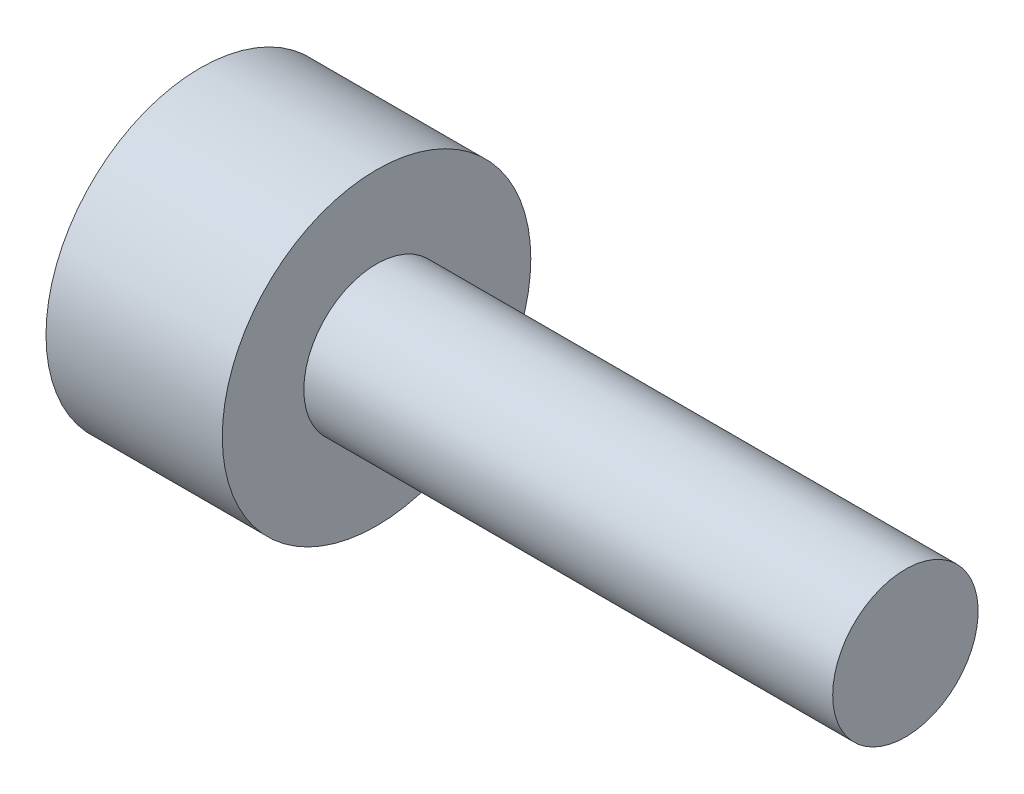
ISO-10303-21;
HEADER;
FILE_DESCRIPTION(('STEP AP214'),'2;1');
FILE_NAME('part.step','',(''),(''),'','','');
FILE_SCHEMA(('AUTOMOTIVE_DESIGN { 1 0 10303 214 1 1 1 1 }'));
ENDSEC;
DATA;
#1=APPLICATION_CONTEXT('core data for automotive mechanical design processes');
#2=APPLICATION_PROTOCOL_DEFINITION('international standard','automotive_design',2000,#1);
#3=PRODUCT_CONTEXT('',#1,'mechanical');
#4=PRODUCT('Part','Part','',(#3));
#5=PRODUCT_RELATED_PRODUCT_CATEGORY('part','',(#4));
#6=PRODUCT_DEFINITION_FORMATION('','',#4);
#7=PRODUCT_DEFINITION_CONTEXT('part definition',#1,'design');
#8=PRODUCT_DEFINITION('design','',#6,#7);
#9=PRODUCT_DEFINITION_SHAPE('','',#8);
#10=(LENGTH_UNIT() NAMED_UNIT(*) SI_UNIT(.MILLI.,.METRE.));
#11=(NAMED_UNIT(*) PLANE_ANGLE_UNIT() SI_UNIT($,.RADIAN.));
#12=(NAMED_UNIT(*) SI_UNIT($,.STERADIAN.) SOLID_ANGLE_UNIT());
#13=UNCERTAINTY_MEASURE_WITH_UNIT(LENGTH_MEASURE(1.E-05),#10,'distance_accuracy_value','');
#14=(GEOMETRIC_REPRESENTATION_CONTEXT(3) GLOBAL_UNCERTAINTY_ASSIGNED_CONTEXT((#13)) GLOBAL_UNIT_ASSIGNED_CONTEXT((#10,
#11,#12)) REPRESENTATION_CONTEXT('',''));
#15=CARTESIAN_POINT('',(0.,0.,0.));
#16=DIRECTION('',(0.,0.,1.));
#17=DIRECTION('',(1.,0.,0.));
#18=AXIS2_PLACEMENT_3D('',#15,#16,#17);
#19=CARTESIAN_POINT('',(-4.,0.,0.));
#20=DIRECTION('',(1.,0.,0.));
#21=DIRECTION('',(0.,0.,-1.));
#22=AXIS2_PLACEMENT_3D('',#19,#20,#21);
#23=PLANE('',#22);
#24=CARTESIAN_POINT('',(-4.,0.,0.));
#25=DIRECTION('',(-1.,0.,0.));
#26=DIRECTION('',(0.,0.,1.));
#27=AXIS2_PLACEMENT_3D('',#24,#25,#26);
#28=CIRCLE('',#27,3.5);
#29=CARTESIAN_POINT('',(-4.,0.,3.5));
#30=VERTEX_POINT('',#29);
#31=EDGE_CURVE('E11',#30,#30,#28,.T.);
#32=ORIENTED_EDGE('',*,*,#31,.T.);
#33=EDGE_LOOP('',(#32));
#34=FACE_BOUND('',#33,.T.);
#35=DIRECTION('',(0.,0.866025403784439,-0.5));
#36=VECTOR('',#35,1.);
#37=CARTESIAN_POINT('',(-4.,-1.5,-0.866025403784439));
#38=LINE('',#37,#36);
#39=CARTESIAN_POINT('',(-4.,-1.5,-0.866025403784439));
#40=VERTEX_POINT('',#39);
#41=CARTESIAN_POINT('',(-4.,0.,-1.73205080756888));
#42=VERTEX_POINT('',#41);
#43=EDGE_CURVE('E54',#40,#42,#38,.T.);
#44=ORIENTED_EDGE('',*,*,#43,.T.);
#45=DIRECTION('',(0.,0.866025403784439,0.5));
#46=VECTOR('',#45,1.);
#47=CARTESIAN_POINT('',(-4.,0.,-1.73205080756888));
#48=LINE('',#47,#46);
#49=CARTESIAN_POINT('',(-4.,1.5,-0.866025403784439));
#50=VERTEX_POINT('',#49);
#51=EDGE_CURVE('E127',#42,#50,#48,.T.);
#52=ORIENTED_EDGE('',*,*,#51,.T.);
#53=DIRECTION('',(0.,0.,1.));
#54=VECTOR('',#53,1.);
#55=CARTESIAN_POINT('',(-4.,1.5,-0.866025403784439));
#56=LINE('',#55,#54);
#57=CARTESIAN_POINT('',(-4.,1.5,0.866025403784438));
#58=VERTEX_POINT('',#57);
#59=EDGE_CURVE('E129',#50,#58,#56,.T.);
#60=ORIENTED_EDGE('',*,*,#59,.T.);
#61=DIRECTION('',(0.,-0.866025403784438,0.5));
#62=VECTOR('',#61,1.);
#63=CARTESIAN_POINT('',(-4.,1.5,0.866025403784438));
#64=LINE('',#63,#62);
#65=CARTESIAN_POINT('',(-4.,0.,1.73205080756888));
#66=VERTEX_POINT('',#65);
#67=EDGE_CURVE('E135',#58,#66,#64,.T.);
#68=ORIENTED_EDGE('',*,*,#67,.T.);
#69=DIRECTION('',(0.,-0.866025403784439,-0.5));
#70=VECTOR('',#69,1.);
#71=CARTESIAN_POINT('',(-4.,0.,1.73205080756888));
#72=LINE('',#71,#70);
#73=CARTESIAN_POINT('',(-4.,-1.5,0.866025403784439));
#74=VERTEX_POINT('',#73);
#75=EDGE_CURVE('E116',#66,#74,#72,.T.);
#76=ORIENTED_EDGE('',*,*,#75,.T.);
#77=DIRECTION('',(0.,0.,-1.));
#78=VECTOR('',#77,1.);
#79=CARTESIAN_POINT('',(-4.,-1.5,0.866025403784439));
#80=LINE('',#79,#78);
#81=EDGE_CURVE('E134',#74,#40,#80,.T.);
#82=ORIENTED_EDGE('',*,*,#81,.T.);
#83=EDGE_LOOP('',(#44,#52,#60,#68,#76,#82));
#84=FACE_BOUND('',#83,.T.);
#85=ADVANCED_FACE('F41',(#34,#84),#23,.F.);
#86=CARTESIAN_POINT('',(-1000.,0.,0.));
#87=DIRECTION('',(-1.,0.,0.));
#88=DIRECTION('',(0.,0.,1.));
#89=AXIS2_PLACEMENT_3D('',#86,#87,#88);
#90=CYLINDRICAL_SURFACE('',#89,3.5);
#91=ORIENTED_EDGE('',*,*,#31,.F.);
#92=EDGE_LOOP('',(#91));
#93=FACE_BOUND('',#92,.T.);
#94=CARTESIAN_POINT('',(0.,0.,0.));
#95=DIRECTION('',(-1.,0.,0.));
#96=DIRECTION('',(0.,0.,1.));
#97=AXIS2_PLACEMENT_3D('',#94,#95,#96);
#98=CIRCLE('',#97,3.5);
#99=CARTESIAN_POINT('',(0.,0.,3.5));
#100=VERTEX_POINT('',#99);
#101=EDGE_CURVE('E48',#100,#100,#98,.T.);
#102=ORIENTED_EDGE('',*,*,#101,.T.);
#103=EDGE_LOOP('',(#102));
#104=FACE_BOUND('',#103,.T.);
#105=ADVANCED_FACE('F152',(#93,#104),#90,.T.);
#106=CARTESIAN_POINT('',(0.,3.5,0.));
#107=DIRECTION('',(-1.,0.,0.));
#108=DIRECTION('',(0.,0.,1.));
#109=AXIS2_PLACEMENT_3D('',#106,#107,#108);
#110=PLANE('',#109);
#111=ORIENTED_EDGE('',*,*,#101,.F.);
#112=EDGE_LOOP('',(#111));
#113=FACE_BOUND('',#112,.T.);
#114=CARTESIAN_POINT('',(0.,0.,0.));
#115=DIRECTION('',(-1.,0.,0.));
#116=DIRECTION('',(0.,0.,1.));
#117=AXIS2_PLACEMENT_3D('',#114,#115,#116);
#118=CIRCLE('',#117,1.65);
#119=CARTESIAN_POINT('',(0.,0.,1.65));
#120=VERTEX_POINT('',#119);
#121=EDGE_CURVE('E149',#120,#120,#118,.T.);
#122=ORIENTED_EDGE('',*,*,#121,.T.);
#123=EDGE_LOOP('',(#122));
#124=FACE_BOUND('',#123,.T.);
#125=ADVANCED_FACE('F156',(#113,#124),#110,.F.);
#126=CARTESIAN_POINT('',(-1000.,0.,0.));
#127=DIRECTION('',(-1.,0.,0.));
#128=DIRECTION('',(0.,0.,1.));
#129=AXIS2_PLACEMENT_3D('',#126,#127,#128);
#130=CYLINDRICAL_SURFACE('',#129,1.65);
#131=ORIENTED_EDGE('',*,*,#121,.F.);
#132=EDGE_LOOP('',(#131));
#133=FACE_BOUND('',#132,.T.);
#134=CARTESIAN_POINT('',(12.,0.,0.));
#135=DIRECTION('',(-1.,0.,0.));
#136=DIRECTION('',(0.,0.,1.));
#137=AXIS2_PLACEMENT_3D('',#134,#135,#136);
#138=CIRCLE('',#137,1.65);
#139=CARTESIAN_POINT('',(12.,0.,1.65));
#140=VERTEX_POINT('',#139);
#141=EDGE_CURVE('E148',#140,#140,#138,.T.);
#142=ORIENTED_EDGE('',*,*,#141,.T.);
#143=EDGE_LOOP('',(#142));
#144=FACE_BOUND('',#143,.T.);
#145=ADVANCED_FACE('F157',(#133,#144),#130,.T.);
#146=CARTESIAN_POINT('',(12.,1.65,0.));
#147=DIRECTION('',(-1.,0.,0.));
#148=DIRECTION('',(0.,0.,1.));
#149=AXIS2_PLACEMENT_3D('',#146,#147,#148);
#150=PLANE('',#149);
#151=ORIENTED_EDGE('',*,*,#141,.F.);
#152=EDGE_LOOP('',(#151));
#153=FACE_BOUND('',#152,.T.);
#154=ADVANCED_FACE('F164',(#153),#150,.F.);
#155=CARTESIAN_POINT('',(-2.,-1.5,-0.866025403784439));
#156=DIRECTION('',(0.,0.5,0.866025403784439));
#157=DIRECTION('',(0.,-0.866025403784439,0.5));
#158=AXIS2_PLACEMENT_3D('',#155,#156,#157);
#159=PLANE('',#158);
#160=ORIENTED_EDGE('',*,*,#43,.F.);
#161=DIRECTION('',(-1.,0.,0.));
#162=VECTOR('',#161,1.);
#163=CARTESIAN_POINT('',(-2.,-1.5,-0.866025403784439));
#164=LINE('',#163,#162);
#165=CARTESIAN_POINT('',(-2.,-1.5,-0.866025403784439));
#166=VERTEX_POINT('',#165);
#167=EDGE_CURVE('E121',#166,#40,#164,.T.);
#168=ORIENTED_EDGE('',*,*,#167,.F.);
#169=DIRECTION('',(0.,0.866025403784439,-0.5));
#170=VECTOR('',#169,1.);
#171=CARTESIAN_POINT('',(-2.,-1.5,-0.866025403784439));
#172=LINE('',#171,#170);
#173=CARTESIAN_POINT('',(-2.,0.,-1.73205080756888));
#174=VERTEX_POINT('',#173);
#175=EDGE_CURVE('E137',#166,#174,#172,.T.);
#176=ORIENTED_EDGE('',*,*,#175,.T.);
#177=DIRECTION('',(-1.,0.,0.));
#178=VECTOR('',#177,1.);
#179=CARTESIAN_POINT('',(-2.,0.,-1.73205080756888));
#180=LINE('',#179,#178);
#181=EDGE_CURVE('E145',#174,#42,#180,.T.);
#182=ORIENTED_EDGE('',*,*,#181,.T.);
#183=EDGE_LOOP('',(#160,#168,#176,#182));
#184=FACE_BOUND('',#183,.T.);
#185=ADVANCED_FACE('F168',(#184),#159,.T.);
#186=CARTESIAN_POINT('',(-2.,0.,-1.73205080756888));
#187=DIRECTION('',(0.,-0.5,0.866025403784439));
#188=DIRECTION('',(0.,-0.866025403784439,-0.5));
#189=AXIS2_PLACEMENT_3D('',#186,#187,#188);
#190=PLANE('',#189);
#191=ORIENTED_EDGE('',*,*,#51,.F.);
#192=ORIENTED_EDGE('',*,*,#181,.F.);
#193=DIRECTION('',(0.,0.866025403784439,0.5));
#194=VECTOR('',#193,1.);
#195=CARTESIAN_POINT('',(-2.,0.,-1.73205080756888));
#196=LINE('',#195,#194);
#197=CARTESIAN_POINT('',(-2.,1.5,-0.866025403784439));
#198=VERTEX_POINT('',#197);
#199=EDGE_CURVE('E94',#174,#198,#196,.T.);
#200=ORIENTED_EDGE('',*,*,#199,.T.);
#201=DIRECTION('',(-1.,0.,0.));
#202=VECTOR('',#201,1.);
#203=CARTESIAN_POINT('',(-2.,1.5,-0.866025403784439));
#204=LINE('',#203,#202);
#205=EDGE_CURVE('E142',#198,#50,#204,.T.);
#206=ORIENTED_EDGE('',*,*,#205,.T.);
#207=EDGE_LOOP('',(#191,#192,#200,#206));
#208=FACE_BOUND('',#207,.T.);
#209=ADVANCED_FACE('F176',(#208),#190,.T.);
#210=CARTESIAN_POINT('',(-2.,1.5,-0.866025403784439));
#211=DIRECTION('',(0.,-1.,0.));
#212=DIRECTION('',(0.,0.,-1.));
#213=AXIS2_PLACEMENT_3D('',#210,#211,#212);
#214=PLANE('',#213);
#215=ORIENTED_EDGE('',*,*,#59,.F.);
#216=ORIENTED_EDGE('',*,*,#205,.F.);
#217=DIRECTION('',(0.,0.,1.));
#218=VECTOR('',#217,1.);
#219=CARTESIAN_POINT('',(-2.,1.5,-0.866025403784439));
#220=LINE('',#219,#218);
#221=CARTESIAN_POINT('',(-2.,1.5,0.866025403784438));
#222=VERTEX_POINT('',#221);
#223=EDGE_CURVE('E115',#198,#222,#220,.T.);
#224=ORIENTED_EDGE('',*,*,#223,.T.);
#225=DIRECTION('',(-1.,0.,0.));
#226=VECTOR('',#225,1.);
#227=CARTESIAN_POINT('',(-2.,1.5,0.866025403784438));
#228=LINE('',#227,#226);
#229=EDGE_CURVE('E108',#222,#58,#228,.T.);
#230=ORIENTED_EDGE('',*,*,#229,.T.);
#231=EDGE_LOOP('',(#215,#216,#224,#230));
#232=FACE_BOUND('',#231,.T.);
#233=ADVANCED_FACE('F195',(#232),#214,.T.);
#234=CARTESIAN_POINT('',(-2.,1.5,0.866025403784438));
#235=DIRECTION('',(0.,-0.5,-0.866025403784439));
#236=DIRECTION('',(0.,0.866025403784438,-0.5));
#237=AXIS2_PLACEMENT_3D('',#234,#235,#236);
#238=PLANE('',#237);
#239=ORIENTED_EDGE('',*,*,#67,.F.);
#240=ORIENTED_EDGE('',*,*,#229,.F.);
#241=DIRECTION('',(0.,-0.866025403784438,0.5));
#242=VECTOR('',#241,1.);
#243=CARTESIAN_POINT('',(-2.,1.5,0.866025403784438));
#244=LINE('',#243,#242);
#245=CARTESIAN_POINT('',(-2.,0.,1.73205080756888));
#246=VERTEX_POINT('',#245);
#247=EDGE_CURVE('E102',#222,#246,#244,.T.);
#248=ORIENTED_EDGE('',*,*,#247,.T.);
#249=DIRECTION('',(-1.,0.,0.));
#250=VECTOR('',#249,1.);
#251=CARTESIAN_POINT('',(-2.,0.,1.73205080756888));
#252=LINE('',#251,#250);
#253=EDGE_CURVE('E107',#246,#66,#252,.T.);
#254=ORIENTED_EDGE('',*,*,#253,.T.);
#255=EDGE_LOOP('',(#239,#240,#248,#254));
#256=FACE_BOUND('',#255,.T.);
#257=ADVANCED_FACE('F110',(#256),#238,.T.);
#258=CARTESIAN_POINT('',(-2.,0.,1.73205080756888));
#259=DIRECTION('',(0.,0.5,-0.866025403784439));
#260=DIRECTION('',(0.,0.866025403784439,0.5));
#261=AXIS2_PLACEMENT_3D('',#258,#259,#260);
#262=PLANE('',#261);
#263=ORIENTED_EDGE('',*,*,#75,.F.);
#264=ORIENTED_EDGE('',*,*,#253,.F.);
#265=DIRECTION('',(0.,-0.866025403784439,-0.5));
#266=VECTOR('',#265,1.);
#267=CARTESIAN_POINT('',(-2.,0.,1.73205080756888));
#268=LINE('',#267,#266);
#269=CARTESIAN_POINT('',(-2.,-1.5,0.866025403784439));
#270=VERTEX_POINT('',#269);
#271=EDGE_CURVE('E112',#246,#270,#268,.T.);
#272=ORIENTED_EDGE('',*,*,#271,.T.);
#273=DIRECTION('',(-1.,0.,0.));
#274=VECTOR('',#273,1.);
#275=CARTESIAN_POINT('',(-2.,-1.5,0.866025403784439));
#276=LINE('',#275,#274);
#277=EDGE_CURVE('E84',#270,#74,#276,.T.);
#278=ORIENTED_EDGE('',*,*,#277,.T.);
#279=EDGE_LOOP('',(#263,#264,#272,#278));
#280=FACE_BOUND('',#279,.T.);
#281=ADVANCED_FACE('F111',(#280),#262,.T.);
#282=CARTESIAN_POINT('',(-2.,-1.5,0.866025403784439));
#283=DIRECTION('',(0.,1.,0.));
#284=DIRECTION('',(0.,0.,1.));
#285=AXIS2_PLACEMENT_3D('',#282,#283,#284);
#286=PLANE('',#285);
#287=ORIENTED_EDGE('',*,*,#81,.F.);
#288=ORIENTED_EDGE('',*,*,#277,.F.);
#289=DIRECTION('',(0.,0.,-1.));
#290=VECTOR('',#289,1.);
#291=CARTESIAN_POINT('',(-2.,-1.5,0.866025403784439));
#292=LINE('',#291,#290);
#293=EDGE_CURVE('E62',#270,#166,#292,.T.);
#294=ORIENTED_EDGE('',*,*,#293,.T.);
#295=ORIENTED_EDGE('',*,*,#167,.T.);
#296=EDGE_LOOP('',(#287,#288,#294,#295));
#297=FACE_BOUND('',#296,.T.);
#298=ADVANCED_FACE('F183',(#297),#286,.T.);
#299=CARTESIAN_POINT('',(-2.,0.,0.));
#300=DIRECTION('',(1.,0.,0.));
#301=DIRECTION('',(0.,0.,-1.));
#302=AXIS2_PLACEMENT_3D('',#299,#300,#301);
#303=PLANE('',#302);
#304=ORIENTED_EDGE('',*,*,#175,.F.);
#305=ORIENTED_EDGE('',*,*,#293,.F.);
#306=ORIENTED_EDGE('',*,*,#271,.F.);
#307=ORIENTED_EDGE('',*,*,#247,.F.);
#308=ORIENTED_EDGE('',*,*,#223,.F.);
#309=ORIENTED_EDGE('',*,*,#199,.F.);
#310=EDGE_LOOP('',(#304,#305,#306,#307,#308,#309));
#311=FACE_BOUND('',#310,.T.);
#312=ADVANCED_FACE('F118',(#311),#303,.F.);
#313=CLOSED_SHELL('',(#85,#105,#125,#145,#154,#185,#209,#233,#257,#281,#298,#312));
#314=MANIFOLD_SOLID_BREP('B2',#313);
#315=ADVANCED_BREP_SHAPE_REPRESENTATION('',(#18,#314),#14);
#316=SHAPE_DEFINITION_REPRESENTATION(#9,#315);
ENDSEC;
END-ISO-10303-21;
